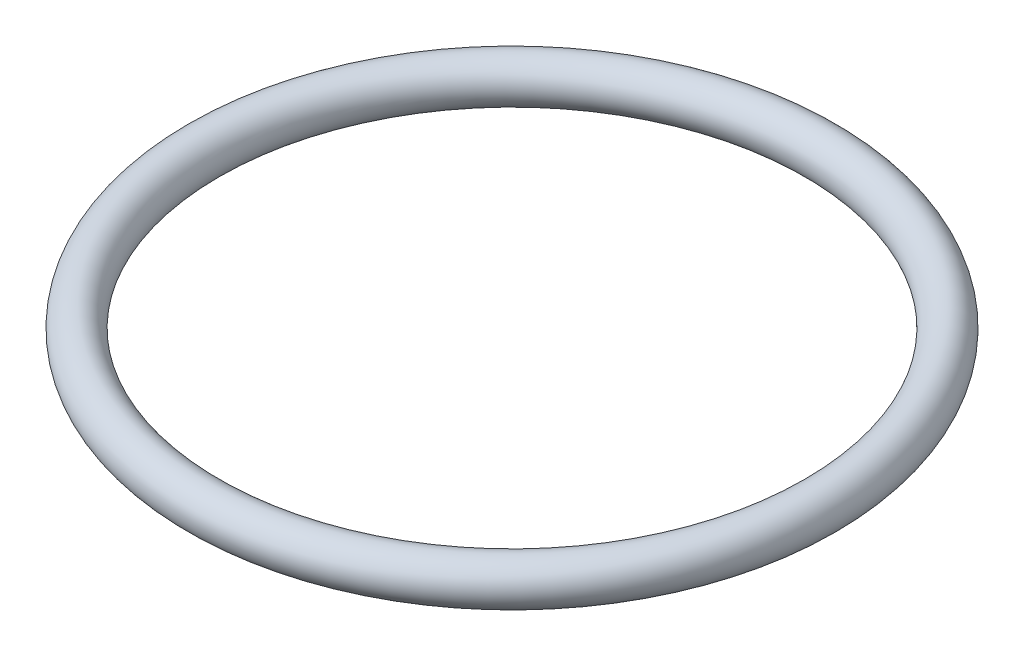
ISO-10303-21;
HEADER;
FILE_DESCRIPTION(('STEP AP214'),'2;1');
FILE_NAME('part.step','',(''),(''),'','','');
FILE_SCHEMA(('AUTOMOTIVE_DESIGN { 1 0 10303 214 1 1 1 1 }'));
ENDSEC;
DATA;
#1=APPLICATION_CONTEXT('core data for automotive mechanical design processes');
#2=APPLICATION_PROTOCOL_DEFINITION('international standard','automotive_design',2000,#1);
#3=PRODUCT_CONTEXT('',#1,'mechanical');
#4=PRODUCT('Part','Part','',(#3));
#5=PRODUCT_RELATED_PRODUCT_CATEGORY('part','',(#4));
#6=PRODUCT_DEFINITION_FORMATION('','',#4);
#7=PRODUCT_DEFINITION_CONTEXT('part definition',#1,'design');
#8=PRODUCT_DEFINITION('design','',#6,#7);
#9=PRODUCT_DEFINITION_SHAPE('','',#8);
#10=(LENGTH_UNIT() NAMED_UNIT(*) SI_UNIT(.MILLI.,.METRE.));
#11=(NAMED_UNIT(*) PLANE_ANGLE_UNIT() SI_UNIT($,.RADIAN.));
#12=(NAMED_UNIT(*) SI_UNIT($,.STERADIAN.) SOLID_ANGLE_UNIT());
#13=UNCERTAINTY_MEASURE_WITH_UNIT(LENGTH_MEASURE(1.E-05),#10,'distance_accuracy_value','');
#14=(GEOMETRIC_REPRESENTATION_CONTEXT(3) GLOBAL_UNCERTAINTY_ASSIGNED_CONTEXT((#13)) GLOBAL_UNIT_ASSIGNED_CONTEXT((#10,
#11,#12)) REPRESENTATION_CONTEXT('',''));
#15=CARTESIAN_POINT('',(0.,0.,0.));
#16=DIRECTION('',(0.,0.,1.));
#17=DIRECTION('',(1.,0.,0.));
#18=AXIS2_PLACEMENT_3D('',#15,#16,#17);
#19=CARTESIAN_POINT('',(0.,0.,0.));
#20=DIRECTION('',(0.,1.,0.));
#21=DIRECTION('',(0.,0.,1.));
#22=AXIS2_PLACEMENT_3D('',#19,#20,#21);
#23=TOROIDAL_SURFACE('',#22,361.95,25.4);
#24=CARTESIAN_POINT('',(-361.95,0.,0.));
#25=DIRECTION('',(0.,0.,1.));
#26=DIRECTION('',(1.,0.,0.));
#27=AXIS2_PLACEMENT_3D('',#24,#25,#26);
#28=CIRCLE('',#27,25.4);
#29=CARTESIAN_POINT('',(-387.35,0.,0.));
#30=VERTEX_POINT('',#29);
#31=EDGE_CURVE('E10',#30,#30,#28,.T.);
#32=CARTESIAN_POINT('',(0.,0.,0.));
#33=DIRECTION('',(0.,1.,0.));
#34=DIRECTION('',(0.,0.,1.));
#35=AXIS2_PLACEMENT_3D('',#32,#33,#34);
#36=CIRCLE('',#35,387.35);
#37=EDGE_CURVE('',#30,#30,#36,.T.);
#38=ORIENTED_EDGE('',*,*,#31,.T.);
#39=ORIENTED_EDGE('',*,*,#31,.F.);
#40=ORIENTED_EDGE('',*,*,#37,.T.);
#41=ORIENTED_EDGE('',*,*,#37,.F.);
#42=EDGE_LOOP('',(#38,#40,#39,#41));
#43=FACE_BOUND('',#42,.T.);
#44=ADVANCED_FACE('F30',(#43),#23,.T.);
#45=CLOSED_SHELL('',(#44));
#46=MANIFOLD_SOLID_BREP('B2',#45);
#47=ADVANCED_BREP_SHAPE_REPRESENTATION('',(#18,#46),#14);
#48=SHAPE_DEFINITION_REPRESENTATION(#9,#47);
ENDSEC;
END-ISO-10303-21;
